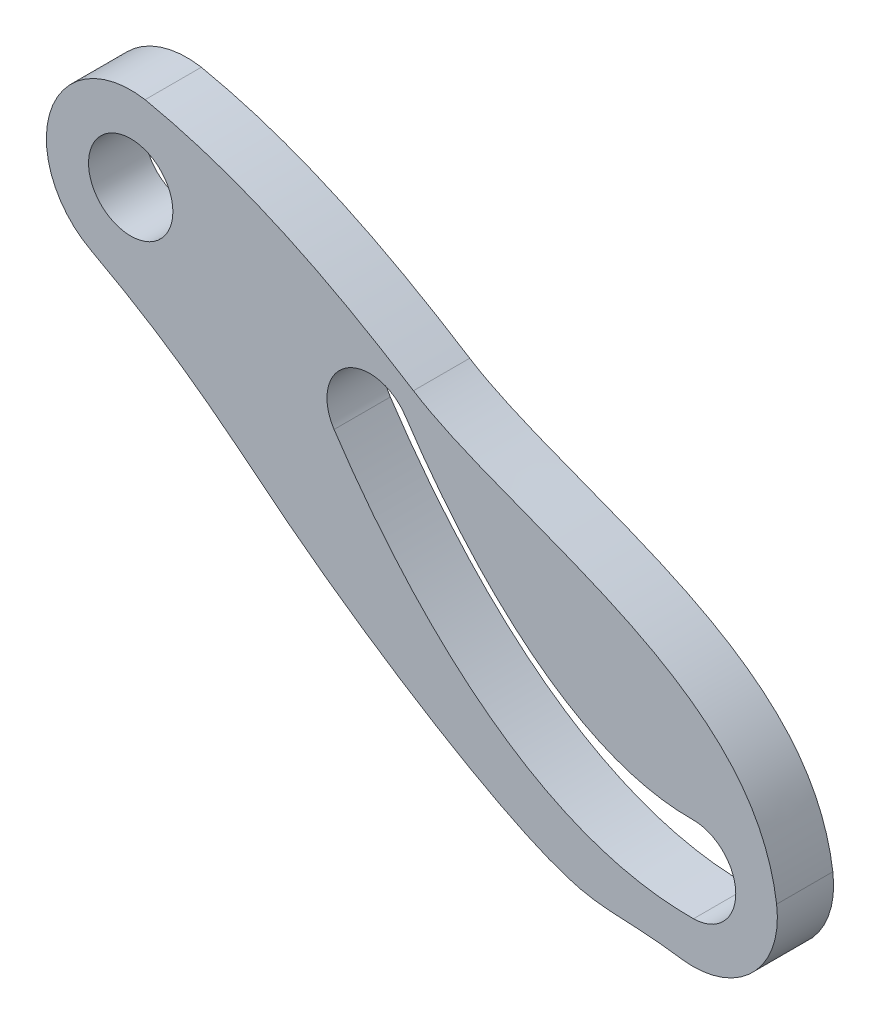
ISO-10303-21;
HEADER;
FILE_DESCRIPTION(('STEP AP214'),'2;1');
FILE_NAME('part.step','',(''),(''),'','','');
FILE_SCHEMA(('AUTOMOTIVE_DESIGN { 1 0 10303 214 1 1 1 1 }'));
ENDSEC;
DATA;
#1=APPLICATION_CONTEXT('core data for automotive mechanical design processes');
#2=APPLICATION_PROTOCOL_DEFINITION('international standard','automotive_design',2000,#1);
#3=PRODUCT_CONTEXT('',#1,'mechanical');
#4=PRODUCT('Part','Part','',(#3));
#5=PRODUCT_RELATED_PRODUCT_CATEGORY('part','',(#4));
#6=PRODUCT_DEFINITION_FORMATION('','',#4);
#7=PRODUCT_DEFINITION_CONTEXT('part definition',#1,'design');
#8=PRODUCT_DEFINITION('design','',#6,#7);
#9=PRODUCT_DEFINITION_SHAPE('','',#8);
#10=(LENGTH_UNIT() NAMED_UNIT(*) SI_UNIT(.MILLI.,.METRE.));
#11=(NAMED_UNIT(*) PLANE_ANGLE_UNIT() SI_UNIT($,.RADIAN.));
#12=(NAMED_UNIT(*) SI_UNIT($,.STERADIAN.) SOLID_ANGLE_UNIT());
#13=UNCERTAINTY_MEASURE_WITH_UNIT(LENGTH_MEASURE(1.E-05),#10,'distance_accuracy_value','');
#14=(GEOMETRIC_REPRESENTATION_CONTEXT(3) GLOBAL_UNCERTAINTY_ASSIGNED_CONTEXT((#13)) GLOBAL_UNIT_ASSIGNED_CONTEXT((#10,
#11,#12)) REPRESENTATION_CONTEXT('',''));
#15=CARTESIAN_POINT('',(0.,0.,0.));
#16=DIRECTION('',(0.,0.,1.));
#17=DIRECTION('',(1.,0.,0.));
#18=AXIS2_PLACEMENT_3D('',#15,#16,#17);
#19=CARTESIAN_POINT('',(-7.98788818183978,5.9559670982101,-8.));
#20=CARTESIAN_POINT('',(-0.0778447381384543,4.31079826261278,-8.));
#21=CARTESIAN_POINT('',(5.45205039812748,-1.61649679540463,-8.));
#22=CARTESIAN_POINT('',(12.3820133461715,-5.13258784665068,-8.));
#23=B_SPLINE_CURVE_WITH_KNOTS('',3,(#19,#20,#21,#22),.UNSPECIFIED.,.F.,.F.,(4,4),(0.,1.),.UNSPECIFIED.);
#24=DIRECTION('',(0.,0.,1.));
#25=VECTOR('',#24,1.);
#26=SURFACE_OF_LINEAR_EXTRUSION('',#23,#25);
#27=DIRECTION('',(0.,0.,1.));
#28=VECTOR('',#27,1.);
#29=CARTESIAN_POINT('',(1.55672193573123,1.76411335962156,0.));
#30=LINE('',#29,#28);
#31=CARTESIAN_POINT('',(1.55672193573123,1.76411335962156,0.));
#32=VERTEX_POINT('',#31);
#33=CARTESIAN_POINT('',(1.55672193573123,1.76411335962156,2.));
#34=VERTEX_POINT('',#33);
#35=EDGE_CURVE('E89',#32,#34,#30,.T.);
#36=ORIENTED_EDGE('',*,*,#35,.F.);
#37=CARTESIAN_POINT('',(-7.98788818183978,5.9559670982101,0.));
#38=CARTESIAN_POINT('',(-0.0778447381384543,4.31079826261278,0.));
#39=CARTESIAN_POINT('',(5.45205039812748,-1.61649679540463,0.));
#40=CARTESIAN_POINT('',(12.3820133461715,-5.13258784665068,0.));
#41=B_SPLINE_CURVE_WITH_KNOTS('',3,(#37,#38,#39,#40),.UNSPECIFIED.,.F.,.F.,(4,4),(0.,1.),.UNSPECIFIED.);
#42=CARTESIAN_POINT('',(-7.98788818183978,5.9559670982101,0.));
#43=VERTEX_POINT('',#42);
#44=EDGE_CURVE('E92',#43,#32,#41,.T.);
#45=ORIENTED_EDGE('',*,*,#44,.F.);
#46=DIRECTION('',(0.,0.,-1.));
#47=VECTOR('',#46,1.);
#48=CARTESIAN_POINT('',(-7.98788818183978,5.9559670982101,2.));
#49=LINE('',#48,#47);
#50=CARTESIAN_POINT('',(-7.98788818183978,5.9559670982101,2.));
#51=VERTEX_POINT('',#50);
#52=EDGE_CURVE('E205',#51,#43,#49,.T.);
#53=ORIENTED_EDGE('',*,*,#52,.F.);
#54=CARTESIAN_POINT('',(-7.98788818183978,5.9559670982101,2.));
#55=CARTESIAN_POINT('',(-0.0778447381384543,4.31079826261278,2.));
#56=CARTESIAN_POINT('',(5.45205039812748,-1.61649679540463,2.));
#57=CARTESIAN_POINT('',(12.3820133461715,-5.13258784665068,2.));
#58=B_SPLINE_CURVE_WITH_KNOTS('',3,(#54,#55,#56,#57),.UNSPECIFIED.,.F.,.F.,(4,4),(0.,1.),.UNSPECIFIED.);
#59=EDGE_CURVE('E95',#51,#34,#58,.T.);
#60=ORIENTED_EDGE('',*,*,#59,.T.);
#61=EDGE_LOOP('',(#36,#45,#53,#60));
#62=FACE_BOUND('',#61,.T.);
#63=ADVANCED_FACE('F46',(#62),#26,.F.);
#64=CARTESIAN_POINT('',(-8.5,3.,2.));
#65=DIRECTION('',(0.,0.,-1.));
#66=DIRECTION('',(-1.,0.,0.));
#67=AXIS2_PLACEMENT_3D('',#64,#65,#66);
#68=CYLINDRICAL_SURFACE('',#67,3.);
#69=CARTESIAN_POINT('',(-8.5,3.,0.));
#70=DIRECTION('',(0.,0.,1.));
#71=DIRECTION('',(1.,0.,0.));
#72=AXIS2_PLACEMENT_3D('',#69,#70,#71);
#73=CIRCLE('',#72,3.);
#74=CARTESIAN_POINT('',(-9.91985742712085,0.357273209987504,0.));
#75=VERTEX_POINT('',#74);
#76=EDGE_CURVE('E104',#43,#75,#73,.T.);
#77=ORIENTED_EDGE('',*,*,#76,.T.);
#78=DIRECTION('',(0.,0.,-1.));
#79=VECTOR('',#78,1.);
#80=CARTESIAN_POINT('',(-9.91985742712085,0.357273209987504,2.));
#81=LINE('',#80,#79);
#82=CARTESIAN_POINT('',(-9.91985742712085,0.357273209987504,2.));
#83=VERTEX_POINT('',#82);
#84=EDGE_CURVE('E11',#83,#75,#81,.T.);
#85=ORIENTED_EDGE('',*,*,#84,.F.);
#86=CARTESIAN_POINT('',(-8.5,3.,2.));
#87=DIRECTION('',(0.,0.,1.));
#88=DIRECTION('',(1.,0.,0.));
#89=AXIS2_PLACEMENT_3D('',#86,#87,#88);
#90=CIRCLE('',#89,3.);
#91=EDGE_CURVE('E162',#51,#83,#90,.T.);
#92=ORIENTED_EDGE('',*,*,#91,.F.);
#93=ORIENTED_EDGE('',*,*,#52,.T.);
#94=EDGE_LOOP('',(#77,#85,#92,#93));
#95=FACE_BOUND('',#94,.T.);
#96=ADVANCED_FACE('F138',(#95),#68,.T.);
#97=CARTESIAN_POINT('',(-9.91985742712085,0.357273209987503,2.));
#98=CARTESIAN_POINT('',(-6.21451330136886,-1.63349647413966,2.));
#99=CARTESIAN_POINT('',(-3.20775714375126,-4.777239804756,2.));
#100=CARTESIAN_POINT('',(7.07814762729556,-11.2734560699574,2.));
#101=CARTESIAN_POINT('',(9.12697601939863,-10.6948209477677,2.));
#102=CARTESIAN_POINT('',(11.0807594615572,-10.9705617938239,2.));
#103=B_SPLINE_CURVE_WITH_KNOTS('',3,(#97,#98,#99,#100,#101,#102),.UNSPECIFIED.,.F.,.F.,(4,1,1,
4),(0.,0.359134015565673,0.78311646116764,1.),.UNSPECIFIED.);
#104=DIRECTION('',(0.,0.,-1.));
#105=VECTOR('',#104,1.);
#106=SURFACE_OF_LINEAR_EXTRUSION('',#103,#105);
#107=CARTESIAN_POINT('',(-9.91985742712085,0.357273209987503,0.));
#108=CARTESIAN_POINT('',(-6.21451330136886,-1.63349647413966,0.));
#109=CARTESIAN_POINT('',(-3.20775714375126,-4.777239804756,0.));
#110=CARTESIAN_POINT('',(7.07814762729556,-11.2734560699574,0.));
#111=CARTESIAN_POINT('',(9.12697601939863,-10.6948209477677,0.));
#112=CARTESIAN_POINT('',(11.0807594615572,-10.9705617938239,0.));
#113=B_SPLINE_CURVE_WITH_KNOTS('',3,(#107,#108,#109,#110,#111,#112),.UNSPECIFIED.,.F.,.F.,(4,1,
1,4),(0.,0.359134015565673,0.78311646116764,1.),.UNSPECIFIED.);
#114=CARTESIAN_POINT('',(11.0807594615572,-10.9705617938239,0.));
#115=VERTEX_POINT('',#114);
#116=EDGE_CURVE('E194',#75,#115,#113,.T.);
#117=ORIENTED_EDGE('',*,*,#116,.T.);
#118=DIRECTION('',(0.,0.,-1.));
#119=VECTOR('',#118,1.);
#120=CARTESIAN_POINT('',(11.0807594615572,-10.9705617938239,2.));
#121=LINE('',#120,#119);
#122=CARTESIAN_POINT('',(11.0807594615572,-10.9705617938239,2.));
#123=VERTEX_POINT('',#122);
#124=EDGE_CURVE('E56',#123,#115,#121,.T.);
#125=ORIENTED_EDGE('',*,*,#124,.F.);
#126=EDGE_CURVE('E154',#83,#123,#103,.T.);
#127=ORIENTED_EDGE('',*,*,#126,.F.);
#128=ORIENTED_EDGE('',*,*,#84,.T.);
#129=EDGE_LOOP('',(#117,#125,#127,#128));
#130=FACE_BOUND('',#129,.T.);
#131=ADVANCED_FACE('F148',(#130),#106,.F.);
#132=CARTESIAN_POINT('',(11.5,-8.,2.));
#133=DIRECTION('',(0.,0.,-1.));
#134=DIRECTION('',(-1.,0.,0.));
#135=AXIS2_PLACEMENT_3D('',#132,#133,#134);
#136=CYLINDRICAL_SURFACE('',#135,3.);
#137=CARTESIAN_POINT('',(11.5,-8.,0.));
#138=DIRECTION('',(0.,0.,1.));
#139=DIRECTION('',(1.,0.,0.));
#140=AXIS2_PLACEMENT_3D('',#137,#138,#139);
#141=CIRCLE('',#140,3.);
#142=CARTESIAN_POINT('',(14.472568825187,-7.59523515527386,0.));
#143=VERTEX_POINT('',#142);
#144=EDGE_CURVE('E199',#115,#143,#141,.T.);
#145=ORIENTED_EDGE('',*,*,#144,.T.);
#146=DIRECTION('',(0.,0.,1.));
#147=VECTOR('',#146,1.);
#148=CARTESIAN_POINT('',(14.472568825187,-7.59523515527386,0.));
#149=LINE('',#148,#147);
#150=CARTESIAN_POINT('',(14.472568825187,-7.59523515527386,2.));
#151=VERTEX_POINT('',#150);
#152=EDGE_CURVE('E65',#143,#151,#149,.T.);
#153=ORIENTED_EDGE('',*,*,#152,.T.);
#154=CARTESIAN_POINT('',(11.5,-8.,2.));
#155=DIRECTION('',(0.,0.,1.));
#156=DIRECTION('',(1.,0.,0.));
#157=AXIS2_PLACEMENT_3D('',#154,#155,#156);
#158=CIRCLE('',#157,3.);
#159=EDGE_CURVE('E161',#123,#151,#158,.T.);
#160=ORIENTED_EDGE('',*,*,#159,.F.);
#161=ORIENTED_EDGE('',*,*,#124,.T.);
#162=EDGE_LOOP('',(#145,#153,#160,#161));
#163=FACE_BOUND('',#162,.T.);
#164=ADVANCED_FACE('F145',(#163),#136,.T.);
#165=CARTESIAN_POINT('',(0.,0.,2.));
#166=DIRECTION('',(0.,0.,-1.));
#167=DIRECTION('',(-1.,0.,0.));
#168=AXIS2_PLACEMENT_3D('',#165,#166,#167);
#169=CYLINDRICAL_SURFACE('',#168,1.52);
#170=CARTESIAN_POINT('',(0.,0.,0.));
#171=DIRECTION('',(0.,0.,1.));
#172=DIRECTION('',(1.,0.,0.));
#173=AXIS2_PLACEMENT_3D('',#170,#171,#172);
#174=CIRCLE('',#173,1.52);
#175=CARTESIAN_POINT('',(1.26626093902839,0.84082295062096,0.));
#176=VERTEX_POINT('',#175);
#177=CARTESIAN_POINT('',(-1.26626093902839,-0.84082295062096,0.));
#178=VERTEX_POINT('',#177);
#179=EDGE_CURVE('E105',#176,#178,#174,.T.);
#180=ORIENTED_EDGE('',*,*,#179,.F.);
#181=DIRECTION('',(0.,0.,-1.));
#182=VECTOR('',#181,1.);
#183=CARTESIAN_POINT('',(1.26626093902839,0.84082295062096,2.));
#184=LINE('',#183,#182);
#185=CARTESIAN_POINT('',(1.26626093902839,0.84082295062096,2.));
#186=VERTEX_POINT('',#185);
#187=EDGE_CURVE('E207',#186,#176,#184,.T.);
#188=ORIENTED_EDGE('',*,*,#187,.F.);
#189=CARTESIAN_POINT('',(0.,0.,2.));
#190=DIRECTION('',(0.,0.,1.));
#191=DIRECTION('',(1.,0.,0.));
#192=AXIS2_PLACEMENT_3D('',#189,#190,#191);
#193=CIRCLE('',#192,1.52);
#194=CARTESIAN_POINT('',(-1.26626093902839,-0.84082295062096,2.));
#195=VERTEX_POINT('',#194);
#196=EDGE_CURVE('E204',#186,#195,#193,.T.);
#197=ORIENTED_EDGE('',*,*,#196,.T.);
#198=DIRECTION('',(0.,0.,-1.));
#199=VECTOR('',#198,1.);
#200=CARTESIAN_POINT('',(-1.26626093902839,-0.84082295062096,2.));
#201=LINE('',#200,#199);
#202=EDGE_CURVE('E168',#195,#178,#201,.T.);
#203=ORIENTED_EDGE('',*,*,#202,.T.);
#204=EDGE_LOOP('',(#180,#188,#197,#203));
#205=FACE_BOUND('',#204,.T.);
#206=ADVANCED_FACE('F48',(#205),#169,.F.);
#207=CARTESIAN_POINT('',(1.26626093902839,0.84082295062096,2.));
#208=CARTESIAN_POINT('',(1.57242121743138,0.379752280110057,2.));
#209=CARTESIAN_POINT('',(2.20060230032121,-0.511995349527995,2.));
#210=CARTESIAN_POINT('',(3.65153117937659,-2.3183282547905,2.));
#211=CARTESIAN_POINT('',(5.73124479438164,-4.36936802028103,2.));
#212=CARTESIAN_POINT('',(8.51575053627801,-6.07826896789953,2.));
#213=CARTESIAN_POINT('',(10.4836359490865,-6.49180152078497,2.));
#214=CARTESIAN_POINT('',(11.482195767615,-6.48010427683042,2.));
#215=B_SPLINE_CURVE_WITH_KNOTS('',3,(#207,#208,#209,#210,#211,#212,#213,#214),.UNSPECIFIED.,.F.,
.F.,(4,1,1,1,1,4),(0.,0.125,0.25,0.5,0.75,1.),.UNSPECIFIED.);
#216=DIRECTION('',(0.,0.,-1.));
#217=VECTOR('',#216,1.);
#218=SURFACE_OF_LINEAR_EXTRUSION('',#215,#217);
#219=CARTESIAN_POINT('',(1.26626093902839,0.84082295062096,0.));
#220=CARTESIAN_POINT('',(1.57242121743138,0.379752280110057,0.));
#221=CARTESIAN_POINT('',(2.20060230032121,-0.511995349527995,0.));
#222=CARTESIAN_POINT('',(3.65153117937659,-2.3183282547905,0.));
#223=CARTESIAN_POINT('',(5.73124479438164,-4.36936802028103,0.));
#224=CARTESIAN_POINT('',(8.51575053627801,-6.07826896789953,0.));
#225=CARTESIAN_POINT('',(10.4836359490865,-6.49180152078497,0.));
#226=CARTESIAN_POINT('',(11.482195767615,-6.48010427683042,0.));
#227=B_SPLINE_CURVE_WITH_KNOTS('',3,(#219,#220,#221,#222,#223,#224,#225,#226),.UNSPECIFIED.,.F.,
.F.,(4,1,1,1,1,4),(0.,0.125,0.25,0.5,0.75,1.),.UNSPECIFIED.);
#228=CARTESIAN_POINT('',(11.482195767615,-6.48010427683042,0.));
#229=VERTEX_POINT('',#228);
#230=EDGE_CURVE('E171',#176,#229,#227,.T.);
#231=ORIENTED_EDGE('',*,*,#230,.T.);
#232=DIRECTION('',(0.,0.,-1.));
#233=VECTOR('',#232,1.);
#234=CARTESIAN_POINT('',(11.482195767615,-6.48010427683042,2.));
#235=LINE('',#234,#233);
#236=CARTESIAN_POINT('',(11.482195767615,-6.48010427683042,2.));
#237=VERTEX_POINT('',#236);
#238=EDGE_CURVE('E215',#237,#229,#235,.T.);
#239=ORIENTED_EDGE('',*,*,#238,.F.);
#240=EDGE_CURVE('E229',#186,#237,#215,.T.);
#241=ORIENTED_EDGE('',*,*,#240,.F.);
#242=ORIENTED_EDGE('',*,*,#187,.T.);
#243=EDGE_LOOP('',(#231,#239,#241,#242));
#244=FACE_BOUND('',#243,.T.);
#245=ADVANCED_FACE('F224',(#244),#218,.F.);
#246=CARTESIAN_POINT('',(11.5,-8.,2.));
#247=DIRECTION('',(0.,0.,-1.));
#248=DIRECTION('',(-1.,0.,0.));
#249=AXIS2_PLACEMENT_3D('',#246,#247,#248);
#250=CYLINDRICAL_SURFACE('',#249,1.52);
#251=CARTESIAN_POINT('',(11.5,-8.,0.));
#252=DIRECTION('',(0.,0.,1.));
#253=DIRECTION('',(1.,0.,0.));
#254=AXIS2_PLACEMENT_3D('',#251,#252,#253);
#255=CIRCLE('',#254,1.52);
#256=CARTESIAN_POINT('',(11.517804232385,-9.51989572316958,0.));
#257=VERTEX_POINT('',#256);
#258=EDGE_CURVE('E176',#257,#229,#255,.T.);
#259=ORIENTED_EDGE('',*,*,#258,.F.);
#260=DIRECTION('',(0.,0.,-1.));
#261=VECTOR('',#260,1.);
#262=CARTESIAN_POINT('',(11.517804232385,-9.51989572316958,2.));
#263=LINE('',#262,#261);
#264=CARTESIAN_POINT('',(11.517804232385,-9.51989572316958,2.));
#265=VERTEX_POINT('',#264);
#266=EDGE_CURVE('E212',#265,#257,#263,.T.);
#267=ORIENTED_EDGE('',*,*,#266,.F.);
#268=CARTESIAN_POINT('',(11.5,-8.,2.));
#269=DIRECTION('',(0.,0.,1.));
#270=DIRECTION('',(1.,0.,0.));
#271=AXIS2_PLACEMENT_3D('',#268,#269,#270);
#272=CIRCLE('',#271,1.52);
#273=EDGE_CURVE('E275',#265,#237,#272,.T.);
#274=ORIENTED_EDGE('',*,*,#273,.T.);
#275=ORIENTED_EDGE('',*,*,#238,.T.);
#276=EDGE_LOOP('',(#259,#267,#274,#275));
#277=FACE_BOUND('',#276,.T.);
#278=ADVANCED_FACE('F289',(#277),#250,.F.);
#279=CARTESIAN_POINT('',(-8.5,3.,2.));
#280=DIRECTION('',(0.,0.,-1.));
#281=DIRECTION('',(-1.,0.,0.));
#282=AXIS2_PLACEMENT_3D('',#279,#280,#281);
#283=CYLINDRICAL_SURFACE('',#282,1.5);
#284=CARTESIAN_POINT('',(-8.5,3.,2.));
#285=DIRECTION('',(0.,0.,1.));
#286=DIRECTION('',(1.,0.,0.));
#287=AXIS2_PLACEMENT_3D('',#284,#285,#286);
#288=CIRCLE('',#287,1.5);
#289=CARTESIAN_POINT('',(-7.,3.,2.));
#290=VERTEX_POINT('',#289);
#291=EDGE_CURVE('E271',#290,#290,#288,.T.);
#292=ORIENTED_EDGE('',*,*,#291,.T.);
#293=EDGE_LOOP('',(#292));
#294=FACE_BOUND('',#293,.T.);
#295=CARTESIAN_POINT('',(-8.5,3.,0.));
#296=DIRECTION('',(0.,0.,1.));
#297=DIRECTION('',(1.,0.,0.));
#298=AXIS2_PLACEMENT_3D('',#295,#296,#297);
#299=CIRCLE('',#298,1.5);
#300=CARTESIAN_POINT('',(-7.,3.,0.));
#301=VERTEX_POINT('',#300);
#302=EDGE_CURVE('E187',#301,#301,#299,.T.);
#303=ORIENTED_EDGE('',*,*,#302,.F.);
#304=EDGE_LOOP('',(#303));
#305=FACE_BOUND('',#304,.T.);
#306=ADVANCED_FACE('F288',(#294,#305),#283,.F.);
#307=CARTESIAN_POINT('',(-1.26626093902839,-0.84082295062096,2.));
#308=CARTESIAN_POINT('',(-0.926702959213884,-1.35218982762754,2.));
#309=CARTESIAN_POINT('',(-0.233155532604028,-2.33707750184245,2.));
#310=CARTESIAN_POINT('',(1.39554284764328,-4.36489563169489,2.));
#311=CARTESIAN_POINT('',(3.78940321997095,-6.74140847516311,2.));
#312=CARTESIAN_POINT('',(6.71258633961936,-8.55940239608859,2.));
#313=CARTESIAN_POINT('',(9.35818511806834,-9.38482412230405,2.));
#314=CARTESIAN_POINT('',(10.8051249312787,-9.52824413003686,2.));
#315=CARTESIAN_POINT('',(11.517804232385,-9.51989572316958,2.));
#316=B_SPLINE_CURVE_WITH_KNOTS('',3,(#307,#308,#309,#310,#311,#312,#313,#314,#315),
.UNSPECIFIED.,.F.,.F.,(4,1,1,1,1,1,4),(0.,0.125,0.25,0.5,0.75,0.875,1.),.UNSPECIFIED.);
#317=DIRECTION('',(0.,0.,-1.));
#318=VECTOR('',#317,1.);
#319=SURFACE_OF_LINEAR_EXTRUSION('',#316,#318);
#320=CARTESIAN_POINT('',(-1.26626093902839,-0.84082295062096,0.));
#321=CARTESIAN_POINT('',(-0.926702959213884,-1.35218982762754,0.));
#322=CARTESIAN_POINT('',(-0.233155532604028,-2.33707750184245,0.));
#323=CARTESIAN_POINT('',(1.39554284764328,-4.36489563169489,0.));
#324=CARTESIAN_POINT('',(3.78940321997095,-6.74140847516311,0.));
#325=CARTESIAN_POINT('',(6.71258633961936,-8.55940239608859,0.));
#326=CARTESIAN_POINT('',(9.35818511806834,-9.38482412230405,0.));
#327=CARTESIAN_POINT('',(10.8051249312787,-9.52824413003686,0.));
#328=CARTESIAN_POINT('',(11.517804232385,-9.51989572316958,0.));
#329=B_SPLINE_CURVE_WITH_KNOTS('',3,(#320,#321,#322,#323,#324,#325,#326,#327,#328),
.UNSPECIFIED.,.F.,.F.,(4,1,1,1,1,1,4),(0.,0.125,0.25,0.5,0.75,0.875,1.),.UNSPECIFIED.);
#330=EDGE_CURVE('E182',#178,#257,#329,.T.);
#331=ORIENTED_EDGE('',*,*,#330,.F.);
#332=ORIENTED_EDGE('',*,*,#202,.F.);
#333=EDGE_CURVE('E248',#195,#265,#316,.T.);
#334=ORIENTED_EDGE('',*,*,#333,.T.);
#335=ORIENTED_EDGE('',*,*,#266,.T.);
#336=EDGE_LOOP('',(#331,#332,#334,#335));
#337=FACE_BOUND('',#336,.T.);
#338=ADVANCED_FACE('F142',(#337),#319,.T.);
#339=CARTESIAN_POINT('',(0.,0.,2.));
#340=DIRECTION('',(0.,0.,1.));
#341=DIRECTION('',(1.,0.,0.));
#342=AXIS2_PLACEMENT_3D('',#339,#340,#341);
#343=PLANE('',#342);
#344=ORIENTED_EDGE('',*,*,#159,.T.);
#345=CARTESIAN_POINT('',(14.472568825187,-7.59523515527386,2.));
#346=CARTESIAN_POINT('',(14.3128942914316,-6.42259492378615,2.));
#347=CARTESIAN_POINT('',(12.1325565710677,-1.34406055285387,2.));
#348=CARTESIAN_POINT('',(4.49562899169055,-0.0972851675841801,2.));
#349=CARTESIAN_POINT('',(1.55672196724709,1.76411333966054,2.));
#350=B_SPLINE_CURVE_WITH_KNOTS('',3,(#345,#346,#347,#348,#349),.UNSPECIFIED.,.F.,.F.,(4,1,4),
(0.,0.194277973160074,1.),.UNSPECIFIED.);
#351=CARTESIAN_POINT('',(1.55794942551841,1.76333598551725,2.));
#352=VERTEX_POINT('',#351);
#353=EDGE_CURVE('E110',#151,#352,#350,.T.);
#354=ORIENTED_EDGE('',*,*,#353,.T.);
#355=DIRECTION('',(-0.844801013515001,0.535080599128793,0.));
#356=VECTOR('',#355,1.);
#357=CARTESIAN_POINT('',(1.55794938295752,1.76333591832268,2.));
#358=LINE('',#357,#356);
#359=EDGE_CURVE('E112',#352,#34,#358,.T.);
#360=ORIENTED_EDGE('',*,*,#359,.T.);
#361=ORIENTED_EDGE('',*,*,#59,.F.);
#362=ORIENTED_EDGE('',*,*,#91,.T.);
#363=ORIENTED_EDGE('',*,*,#126,.T.);
#364=EDGE_LOOP('',(#344,#354,#360,#361,#362,#363));
#365=FACE_BOUND('',#364,.T.);
#366=ORIENTED_EDGE('',*,*,#196,.F.);
#367=ORIENTED_EDGE('',*,*,#240,.T.);
#368=ORIENTED_EDGE('',*,*,#273,.F.);
#369=ORIENTED_EDGE('',*,*,#333,.F.);
#370=EDGE_LOOP('',(#366,#367,#368,#369));
#371=FACE_BOUND('',#370,.T.);
#372=ORIENTED_EDGE('',*,*,#291,.F.);
#373=EDGE_LOOP('',(#372));
#374=FACE_BOUND('',#373,.T.);
#375=ADVANCED_FACE('F139',(#365,#371,#374),#343,.T.);
#376=CARTESIAN_POINT('',(0.,0.,0.));
#377=DIRECTION('',(0.,0.,1.));
#378=DIRECTION('',(1.,0.,0.));
#379=AXIS2_PLACEMENT_3D('',#376,#377,#378);
#380=PLANE('',#379);
#381=CARTESIAN_POINT('',(14.472568825187,-7.59523515527386,0.));
#382=CARTESIAN_POINT('',(14.3128942914316,-6.42259492378615,0.));
#383=CARTESIAN_POINT('',(12.1325565710677,-1.34406055285387,0.));
#384=CARTESIAN_POINT('',(4.49562899169055,-0.0972851675841801,0.));
#385=CARTESIAN_POINT('',(1.55672196724709,1.76411333966054,0.));
#386=B_SPLINE_CURVE_WITH_KNOTS('',3,(#381,#382,#383,#384,#385),.UNSPECIFIED.,.F.,.F.,(4,1,4),
(0.,0.194277973160074,1.),.UNSPECIFIED.);
#387=CARTESIAN_POINT('',(1.55794942545424,1.76333598555788,0.));
#388=VERTEX_POINT('',#387);
#389=EDGE_CURVE('E109',#143,#388,#386,.T.);
#390=ORIENTED_EDGE('',*,*,#389,.F.);
#391=ORIENTED_EDGE('',*,*,#144,.F.);
#392=ORIENTED_EDGE('',*,*,#116,.F.);
#393=ORIENTED_EDGE('',*,*,#76,.F.);
#394=ORIENTED_EDGE('',*,*,#44,.T.);
#395=DIRECTION('',(0.844801013515138,-0.535080599128576,0.));
#396=VECTOR('',#395,1.);
#397=CARTESIAN_POINT('',(1.55672193573123,1.76411335962156,0.));
#398=LINE('',#397,#396);
#399=EDGE_CURVE('E50',#388,#32,#398,.F.);
#400=ORIENTED_EDGE('',*,*,#399,.F.);
#401=EDGE_LOOP('',(#390,#391,#392,#393,#394,#400));
#402=FACE_BOUND('',#401,.T.);
#403=ORIENTED_EDGE('',*,*,#179,.T.);
#404=ORIENTED_EDGE('',*,*,#330,.T.);
#405=ORIENTED_EDGE('',*,*,#258,.T.);
#406=ORIENTED_EDGE('',*,*,#230,.F.);
#407=EDGE_LOOP('',(#403,#404,#405,#406));
#408=FACE_BOUND('',#407,.T.);
#409=ORIENTED_EDGE('',*,*,#302,.T.);
#410=EDGE_LOOP('',(#409));
#411=FACE_BOUND('',#410,.T.);
#412=ADVANCED_FACE('F100',(#402,#408,#411),#380,.F.);
#413=DIRECTION('',(0.,0.,1.));
#414=VECTOR('',#413,1.);
#415=SURFACE_OF_LINEAR_EXTRUSION('',#386,#414);
#416=ORIENTED_EDGE('',*,*,#353,.F.);
#417=ORIENTED_EDGE('',*,*,#152,.F.);
#418=ORIENTED_EDGE('',*,*,#389,.T.);
#419=ORIENTED_EDGE('',*,*,#399,.T.);
#420=ORIENTED_EDGE('',*,*,#35,.T.);
#421=ORIENTED_EDGE('',*,*,#359,.F.);
#422=EDGE_LOOP('',(#416,#417,#418,#419,#420,#421));
#423=FACE_BOUND('',#422,.T.);
#424=ADVANCED_FACE('F108',(#423),#415,.T.);
#425=CLOSED_SHELL('',(#63,#96,#131,#164,#206,#245,#278,#306,#338,#375,#412,#424));
#426=MANIFOLD_SOLID_BREP('B2',#425);
#427=ADVANCED_BREP_SHAPE_REPRESENTATION('',(#18,#426),#14);
#428=SHAPE_DEFINITION_REPRESENTATION(#9,#427);
ENDSEC;
END-ISO-10303-21;
